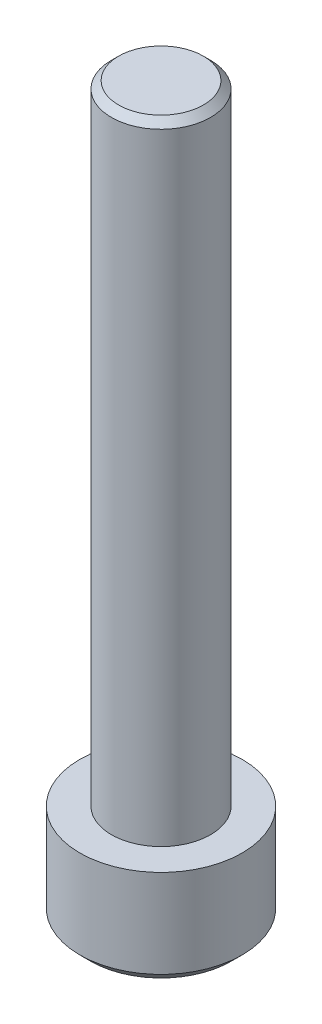
ISO-10303-21;
HEADER;
FILE_DESCRIPTION(('STEP AP214'),'2;1');
FILE_NAME('part.step','',(''),(''),'','','');
FILE_SCHEMA(('AUTOMOTIVE_DESIGN { 1 0 10303 214 1 1 1 1 }'));
ENDSEC;
DATA;
#1=APPLICATION_CONTEXT('core data for automotive mechanical design processes');
#2=APPLICATION_PROTOCOL_DEFINITION('international standard','automotive_design',2000,#1);
#3=PRODUCT_CONTEXT('',#1,'mechanical');
#4=PRODUCT('Part','Part','',(#3));
#5=PRODUCT_RELATED_PRODUCT_CATEGORY('part','',(#4));
#6=PRODUCT_DEFINITION_FORMATION('','',#4);
#7=PRODUCT_DEFINITION_CONTEXT('part definition',#1,'design');
#8=PRODUCT_DEFINITION('design','',#6,#7);
#9=PRODUCT_DEFINITION_SHAPE('','',#8);
#10=(LENGTH_UNIT() NAMED_UNIT(*) SI_UNIT(.MILLI.,.METRE.));
#11=(NAMED_UNIT(*) PLANE_ANGLE_UNIT() SI_UNIT($,.RADIAN.));
#12=(NAMED_UNIT(*) SI_UNIT($,.STERADIAN.) SOLID_ANGLE_UNIT());
#13=UNCERTAINTY_MEASURE_WITH_UNIT(LENGTH_MEASURE(1.E-05),#10,'distance_accuracy_value','');
#14=(GEOMETRIC_REPRESENTATION_CONTEXT(3) GLOBAL_UNCERTAINTY_ASSIGNED_CONTEXT((#13)) GLOBAL_UNIT_ASSIGNED_CONTEXT((#10,
#11,#12)) REPRESENTATION_CONTEXT('',''));
#15=CARTESIAN_POINT('',(0.,0.,0.));
#16=DIRECTION('',(0.,0.,1.));
#17=DIRECTION('',(1.,0.,0.));
#18=AXIS2_PLACEMENT_3D('',#15,#16,#17);
#19=CARTESIAN_POINT('',(-1.60395121659243,-0.2032,0.));
#20=DIRECTION('',(-0.866025403784439,0.,-0.5));
#21=DIRECTION('',(-0.5,0.,0.866025403784439));
#22=AXIS2_PLACEMENT_3D('',#19,#20,#21);
#23=PLANE('',#22);
#24=DIRECTION('',(0.,1.,0.));
#25=VECTOR('',#24,1.);
#26=CARTESIAN_POINT('',(-0.801975608296215,-0.2032,-1.3890625));
#27=LINE('',#26,#25);
#28=CARTESIAN_POINT('',(-0.801975608296215,-3.5052,-1.3890625));
#29=VERTEX_POINT('',#28);
#30=CARTESIAN_POINT('',(-0.801975608296215,-0.2032,-1.3890625));
#31=VERTEX_POINT('',#30);
#32=EDGE_CURVE('E83',#29,#31,#27,.T.);
#33=ORIENTED_EDGE('',*,*,#32,.T.);
#34=DIRECTION('',(-0.5,0.,0.866025403784439));
#35=VECTOR('',#34,1.);
#36=CARTESIAN_POINT('',(-1.60395121659243,-0.2032,0.));
#37=LINE('',#36,#35);
#38=CARTESIAN_POINT('',(-1.60395121659243,-0.2032,0.));
#39=VERTEX_POINT('',#38);
#40=EDGE_CURVE('E72',#39,#31,#37,.F.);
#41=ORIENTED_EDGE('',*,*,#40,.F.);
#42=DIRECTION('',(0.,1.,0.));
#43=VECTOR('',#42,1.);
#44=CARTESIAN_POINT('',(-1.60395121659243,-0.2032,0.));
#45=LINE('',#44,#43);
#46=CARTESIAN_POINT('',(-1.60395121659243,-3.5052,0.));
#47=VERTEX_POINT('',#46);
#48=EDGE_CURVE('E91',#39,#47,#45,.F.);
#49=ORIENTED_EDGE('',*,*,#48,.T.);
#50=DIRECTION('',(-0.5,0.,0.866025403784439));
#51=VECTOR('',#50,1.);
#52=CARTESIAN_POINT('',(-1.60395121659243,-3.5052,0.));
#53=LINE('',#52,#51);
#54=EDGE_CURVE('E67',#29,#47,#53,.T.);
#55=ORIENTED_EDGE('',*,*,#54,.F.);
#56=EDGE_LOOP('',(#33,#41,#49,#55));
#57=FACE_BOUND('',#56,.T.);
#58=ADVANCED_FACE('F17',(#57),#23,.F.);
#59=CARTESIAN_POINT('',(-0.801975608296215,-0.2032,-1.3890625));
#60=DIRECTION('',(0.,0.,-1.));
#61=DIRECTION('',(-1.,0.,0.));
#62=AXIS2_PLACEMENT_3D('',#59,#60,#61);
#63=PLANE('',#62);
#64=DIRECTION('',(0.,1.,0.));
#65=VECTOR('',#64,1.);
#66=CARTESIAN_POINT('',(0.801975608296215,-0.2032,-1.3890625));
#67=LINE('',#66,#65);
#68=CARTESIAN_POINT('',(0.801975608296215,-3.5052,-1.3890625));
#69=VERTEX_POINT('',#68);
#70=CARTESIAN_POINT('',(0.801975608296215,-0.2032,-1.3890625));
#71=VERTEX_POINT('',#70);
#72=EDGE_CURVE('E87',#69,#71,#67,.T.);
#73=ORIENTED_EDGE('',*,*,#72,.T.);
#74=DIRECTION('',(-1.,0.,0.));
#75=VECTOR('',#74,1.);
#76=CARTESIAN_POINT('',(-0.801975608296215,-0.2032,-1.3890625));
#77=LINE('',#76,#75);
#78=EDGE_CURVE('E76',#31,#71,#77,.F.);
#79=ORIENTED_EDGE('',*,*,#78,.F.);
#80=ORIENTED_EDGE('',*,*,#32,.F.);
#81=DIRECTION('',(-1.,0.,0.));
#82=VECTOR('',#81,1.);
#83=CARTESIAN_POINT('',(-0.801975608296215,-3.5052,-1.3890625));
#84=LINE('',#83,#82);
#85=EDGE_CURVE('E89',#69,#29,#84,.T.);
#86=ORIENTED_EDGE('',*,*,#85,.F.);
#87=EDGE_LOOP('',(#73,#79,#80,#86));
#88=FACE_BOUND('',#87,.T.);
#89=ADVANCED_FACE('F86',(#88),#63,.F.);
#90=CARTESIAN_POINT('',(-0.801975608296216,-0.2032,1.3890625));
#91=DIRECTION('',(-0.866025403784439,0.,0.5));
#92=DIRECTION('',(0.5,0.,0.866025403784439));
#93=AXIS2_PLACEMENT_3D('',#90,#91,#92);
#94=PLANE('',#93);
#95=ORIENTED_EDGE('',*,*,#48,.F.);
#96=DIRECTION('',(-0.5,0.,-0.866025403784439));
#97=VECTOR('',#96,1.);
#98=CARTESIAN_POINT('',(-0.801975608296216,-0.2032,1.3890625));
#99=LINE('',#98,#97);
#100=CARTESIAN_POINT('',(-0.801975608296216,-0.2032,1.3890625));
#101=VERTEX_POINT('',#100);
#102=EDGE_CURVE('E79',#101,#39,#99,.T.);
#103=ORIENTED_EDGE('',*,*,#102,.F.);
#104=DIRECTION('',(0.,1.,0.));
#105=VECTOR('',#104,1.);
#106=CARTESIAN_POINT('',(-0.801975608296216,-0.2032,1.3890625));
#107=LINE('',#106,#105);
#108=CARTESIAN_POINT('',(-0.801975608296216,-3.5052,1.3890625));
#109=VERTEX_POINT('',#108);
#110=EDGE_CURVE('E122',#101,#109,#107,.F.);
#111=ORIENTED_EDGE('',*,*,#110,.T.);
#112=DIRECTION('',(0.5,0.,0.866025403784439));
#113=VECTOR('',#112,1.);
#114=CARTESIAN_POINT('',(-0.801975608296216,-3.5052,1.3890625));
#115=LINE('',#114,#113);
#116=EDGE_CURVE('E132',#47,#109,#115,.T.);
#117=ORIENTED_EDGE('',*,*,#116,.F.);
#118=EDGE_LOOP('',(#95,#103,#111,#117));
#119=FACE_BOUND('',#118,.T.);
#120=ADVANCED_FACE('F135',(#119),#94,.F.);
#121=CARTESIAN_POINT('',(0.801975608296215,-0.2032,-1.3890625));
#122=DIRECTION('',(0.866025403784439,0.,-0.5));
#123=DIRECTION('',(-0.5,0.,-0.866025403784439));
#124=AXIS2_PLACEMENT_3D('',#121,#122,#123);
#125=PLANE('',#124);
#126=DIRECTION('',(0.,1.,0.));
#127=VECTOR('',#126,1.);
#128=CARTESIAN_POINT('',(1.60395121659243,-0.2032,0.));
#129=LINE('',#128,#127);
#130=CARTESIAN_POINT('',(1.60395121659243,-3.5052,0.));
#131=VERTEX_POINT('',#130);
#132=CARTESIAN_POINT('',(1.60395121659243,-0.2032,0.));
#133=VERTEX_POINT('',#132);
#134=EDGE_CURVE('E118',#131,#133,#129,.T.);
#135=ORIENTED_EDGE('',*,*,#134,.T.);
#136=DIRECTION('',(0.5,0.,0.866025403784439));
#137=VECTOR('',#136,1.);
#138=CARTESIAN_POINT('',(0.801975608296215,-0.2032,-1.3890625));
#139=LINE('',#138,#137);
#140=EDGE_CURVE('E128',#71,#133,#139,.T.);
#141=ORIENTED_EDGE('',*,*,#140,.F.);
#142=ORIENTED_EDGE('',*,*,#72,.F.);
#143=DIRECTION('',(-0.5,0.,-0.866025403784439));
#144=VECTOR('',#143,1.);
#145=CARTESIAN_POINT('',(0.801975608296215,-3.5052,-1.3890625));
#146=LINE('',#145,#144);
#147=EDGE_CURVE('E35',#131,#69,#146,.T.);
#148=ORIENTED_EDGE('',*,*,#147,.F.);
#149=EDGE_LOOP('',(#135,#141,#142,#148));
#150=FACE_BOUND('',#149,.T.);
#151=ADVANCED_FACE('F142',(#150),#125,.F.);
#152=CARTESIAN_POINT('',(1.60395121659243,-0.2032,0.));
#153=DIRECTION('',(0.,-1.,0.));
#154=DIRECTION('',(0.,0.,-1.));
#155=AXIS2_PLACEMENT_3D('',#152,#153,#154);
#156=PLANE('',#155);
#157=ORIENTED_EDGE('',*,*,#40,.T.);
#158=ORIENTED_EDGE('',*,*,#78,.T.);
#159=ORIENTED_EDGE('',*,*,#140,.T.);
#160=DIRECTION('',(0.5,0.,-0.866025403784439));
#161=VECTOR('',#160,1.);
#162=CARTESIAN_POINT('',(1.60395121659243,-0.2032,0.));
#163=LINE('',#162,#161);
#164=CARTESIAN_POINT('',(0.801975608296215,-0.2032,1.3890625));
#165=VERTEX_POINT('',#164);
#166=EDGE_CURVE('E116',#133,#165,#163,.F.);
#167=ORIENTED_EDGE('',*,*,#166,.T.);
#168=DIRECTION('',(1.,0.,0.));
#169=VECTOR('',#168,1.);
#170=CARTESIAN_POINT('',(0.801975608296215,-0.2032,1.3890625));
#171=LINE('',#170,#169);
#172=EDGE_CURVE('E125',#165,#101,#171,.F.);
#173=ORIENTED_EDGE('',*,*,#172,.T.);
#174=ORIENTED_EDGE('',*,*,#102,.T.);
#175=EDGE_LOOP('',(#157,#158,#159,#167,#173,#174));
#176=FACE_BOUND('',#175,.T.);
#177=ADVANCED_FACE('F73',(#176),#156,.T.);
#178=CARTESIAN_POINT('',(0.801975608296215,-0.2032,1.3890625));
#179=DIRECTION('',(0.,0.,1.));
#180=DIRECTION('',(1.,0.,0.));
#181=AXIS2_PLACEMENT_3D('',#178,#179,#180);
#182=PLANE('',#181);
#183=ORIENTED_EDGE('',*,*,#110,.F.);
#184=ORIENTED_EDGE('',*,*,#172,.F.);
#185=DIRECTION('',(0.,1.,0.));
#186=VECTOR('',#185,1.);
#187=CARTESIAN_POINT('',(0.801975608296214,-0.2032,1.3890625));
#188=LINE('',#187,#186);
#189=CARTESIAN_POINT('',(0.801975608296215,-3.5052,1.3890625));
#190=VERTEX_POINT('',#189);
#191=EDGE_CURVE('E113',#165,#190,#188,.F.);
#192=ORIENTED_EDGE('',*,*,#191,.T.);
#193=DIRECTION('',(1.,0.,0.));
#194=VECTOR('',#193,1.);
#195=CARTESIAN_POINT('',(0.801975608296215,-3.5052,1.3890625));
#196=LINE('',#195,#194);
#197=EDGE_CURVE('E120',#109,#190,#196,.T.);
#198=ORIENTED_EDGE('',*,*,#197,.F.);
#199=EDGE_LOOP('',(#183,#184,#192,#198));
#200=FACE_BOUND('',#199,.T.);
#201=ADVANCED_FACE('F149',(#200),#182,.F.);
#202=CARTESIAN_POINT('',(1.60395121659243,-0.2032,0.));
#203=DIRECTION('',(0.866025403784439,0.,0.5));
#204=DIRECTION('',(0.5,0.,-0.866025403784439));
#205=AXIS2_PLACEMENT_3D('',#202,#203,#204);
#206=PLANE('',#205);
#207=ORIENTED_EDGE('',*,*,#191,.F.);
#208=ORIENTED_EDGE('',*,*,#166,.F.);
#209=ORIENTED_EDGE('',*,*,#134,.F.);
#210=DIRECTION('',(-0.5,0.,0.866025403784438));
#211=VECTOR('',#210,1.);
#212=CARTESIAN_POINT('',(1.60395121659243,-3.5052,0.));
#213=LINE('',#212,#211);
#214=EDGE_CURVE('E108',#131,#190,#213,.T.);
#215=ORIENTED_EDGE('',*,*,#214,.T.);
#216=EDGE_LOOP('',(#207,#208,#209,#215));
#217=FACE_BOUND('',#216,.T.);
#218=ADVANCED_FACE('F147',(#217),#206,.F.);
#219=CARTESIAN_POINT('',(0.,-3.5052,0.));
#220=DIRECTION('',(0.,1.,0.));
#221=DIRECTION('',(0.,0.,1.));
#222=AXIS2_PLACEMENT_3D('',#219,#220,#221);
#223=PLANE('',#222);
#224=ORIENTED_EDGE('',*,*,#147,.T.);
#225=ORIENTED_EDGE('',*,*,#85,.T.);
#226=ORIENTED_EDGE('',*,*,#54,.T.);
#227=ORIENTED_EDGE('',*,*,#116,.T.);
#228=ORIENTED_EDGE('',*,*,#197,.T.);
#229=ORIENTED_EDGE('',*,*,#214,.F.);
#230=EDGE_LOOP('',(#224,#225,#226,#227,#228,#229));
#231=FACE_BOUND('',#230,.T.);
#232=CARTESIAN_POINT('',(0.,-3.50520000006327,0.));
#233=DIRECTION('',(0.,1.,0.));
#234=DIRECTION('',(0.,0.,1.));
#235=AXIS2_PLACEMENT_3D('',#232,#233,#234);
#236=CIRCLE('',#235,2.48919999995678);
#237=CARTESIAN_POINT('',(0.,-3.50520000006327,2.48919999995678));
#238=VERTEX_POINT('',#237);
#239=EDGE_CURVE('E20',#238,#238,#236,.T.);
#240=ORIENTED_EDGE('',*,*,#239,.F.);
#241=EDGE_LOOP('',(#240));
#242=FACE_BOUND('',#241,.T.);
#243=ADVANCED_FACE('F139',(#231,#242),#223,.F.);
#244=CARTESIAN_POINT('',(0.,-3.12420000005886,0.));
#245=DIRECTION('',(0.,1.,0.));
#246=DIRECTION('',(0.,0.,1.));
#247=AXIS2_PLACEMENT_3D('',#244,#245,#246);
#248=CONICAL_SURFACE('',#247,2.87019999996119,0.785398163397448);
#249=ORIENTED_EDGE('',*,*,#239,.T.);
#250=EDGE_LOOP('',(#249));
#251=FACE_BOUND('',#250,.T.);
#252=CARTESIAN_POINT('',(0.,-3.1242,0.));
#253=DIRECTION('',(0.,1.,0.));
#254=DIRECTION('',(0.,0.,1.));
#255=AXIS2_PLACEMENT_3D('',#252,#253,#254);
#256=CIRCLE('',#255,2.8702);
#257=CARTESIAN_POINT('',(0.,-3.1242,2.8702));
#258=VERTEX_POINT('',#257);
#259=EDGE_CURVE('E100',#258,#258,#256,.T.);
#260=ORIENTED_EDGE('',*,*,#259,.F.);
#261=EDGE_LOOP('',(#260));
#262=FACE_BOUND('',#261,.T.);
#263=ADVANCED_FACE('F181',(#251,#262),#248,.T.);
#264=CARTESIAN_POINT('',(0.,22.225,0.));
#265=DIRECTION('',(0.,1.,0.));
#266=DIRECTION('',(0.,0.,1.));
#267=AXIS2_PLACEMENT_3D('',#264,#265,#266);
#268=PLANE('',#267);
#269=CARTESIAN_POINT('',(0.,22.2250000000486,0.));
#270=DIRECTION('',(0.,-1.,0.));
#271=DIRECTION('',(0.,0.,-1.));
#272=AXIS2_PLACEMENT_3D('',#269,#270,#271);
#273=CIRCLE('',#272,1.4985999999908);
#274=CARTESIAN_POINT('',(0.,22.2250000000486,-1.4985999999908));
#275=VERTEX_POINT('',#274);
#276=EDGE_CURVE('E98',#275,#275,#273,.T.);
#277=ORIENTED_EDGE('',*,*,#276,.F.);
#278=EDGE_LOOP('',(#277));
#279=FACE_BOUND('',#278,.T.);
#280=ADVANCED_FACE('F178',(#279),#268,.T.);
#281=CARTESIAN_POINT('',(0.,-3.5052,0.));
#282=DIRECTION('',(0.,1.,0.));
#283=DIRECTION('',(0.,0.,1.));
#284=AXIS2_PLACEMENT_3D('',#281,#282,#283);
#285=CYLINDRICAL_SURFACE('',#284,2.8702);
#286=ORIENTED_EDGE('',*,*,#259,.T.);
#287=EDGE_LOOP('',(#286));
#288=FACE_BOUND('',#287,.T.);
#289=CARTESIAN_POINT('',(0.,0.,0.));
#290=DIRECTION('',(0.,1.,0.));
#291=DIRECTION('',(0.,0.,1.));
#292=AXIS2_PLACEMENT_3D('',#289,#290,#291);
#293=CIRCLE('',#292,2.8702);
#294=CARTESIAN_POINT('',(0.,0.,2.8702));
#295=VERTEX_POINT('',#294);
#296=EDGE_CURVE('E96',#295,#295,#293,.T.);
#297=ORIENTED_EDGE('',*,*,#296,.F.);
#298=EDGE_LOOP('',(#297));
#299=FACE_BOUND('',#298,.T.);
#300=ADVANCED_FACE('F174',(#288,#299),#285,.T.);
#301=CARTESIAN_POINT('',(0.,21.9710000002351,0.));
#302=DIRECTION('',(0.,-1.,0.));
#303=DIRECTION('',(0.,0.,-1.));
#304=AXIS2_PLACEMENT_3D('',#301,#302,#303);
#305=CONICAL_SURFACE('',#304,1.75259999980426,0.785398163397448);
#306=CARTESIAN_POINT('',(0.,21.971,0.));
#307=DIRECTION('',(0.,-1.,0.));
#308=DIRECTION('',(0.,0.,-1.));
#309=AXIS2_PLACEMENT_3D('',#306,#307,#308);
#310=CIRCLE('',#309,1.7526);
#311=CARTESIAN_POINT('',(0.,21.971,-1.7526));
#312=VERTEX_POINT('',#311);
#313=EDGE_CURVE('E26',#312,#312,#310,.T.);
#314=ORIENTED_EDGE('',*,*,#313,.F.);
#315=EDGE_LOOP('',(#314));
#316=FACE_BOUND('',#315,.T.);
#317=ORIENTED_EDGE('',*,*,#276,.T.);
#318=EDGE_LOOP('',(#317));
#319=FACE_BOUND('',#318,.T.);
#320=ADVANCED_FACE('F167',(#316,#319),#305,.T.);
#321=CARTESIAN_POINT('',(0.,0.,0.));
#322=DIRECTION('',(0.,1.,0.));
#323=DIRECTION('',(0.,0.,1.));
#324=AXIS2_PLACEMENT_3D('',#321,#322,#323);
#325=PLANE('',#324);
#326=CARTESIAN_POINT('',(0.,0.,0.));
#327=DIRECTION('',(0.,-1.,0.));
#328=DIRECTION('',(0.,0.,-1.));
#329=AXIS2_PLACEMENT_3D('',#326,#327,#328);
#330=CIRCLE('',#329,1.7526);
#331=CARTESIAN_POINT('',(0.,0.,-1.7526));
#332=VERTEX_POINT('',#331);
#333=EDGE_CURVE('E11',#332,#332,#330,.F.);
#334=ORIENTED_EDGE('',*,*,#333,.F.);
#335=EDGE_LOOP('',(#334));
#336=FACE_BOUND('',#335,.T.);
#337=ORIENTED_EDGE('',*,*,#296,.T.);
#338=EDGE_LOOP('',(#337));
#339=FACE_BOUND('',#338,.T.);
#340=ADVANCED_FACE('F161',(#336,#339),#325,.T.);
#341=CARTESIAN_POINT('',(0.,22.225,0.));
#342=DIRECTION('',(0.,-1.,0.));
#343=DIRECTION('',(0.,0.,-1.));
#344=AXIS2_PLACEMENT_3D('',#341,#342,#343);
#345=CYLINDRICAL_SURFACE('',#344,1.7526);
#346=ORIENTED_EDGE('',*,*,#333,.T.);
#347=EDGE_LOOP('',(#346));
#348=FACE_BOUND('',#347,.T.);
#349=ORIENTED_EDGE('',*,*,#313,.T.);
#350=EDGE_LOOP('',(#349));
#351=FACE_BOUND('',#350,.T.);
#352=ADVANCED_FACE('F159',(#348,#351),#345,.T.);
#353=CLOSED_SHELL('',(#58,#89,#120,#151,#177,#201,#218,#243,#263,#280,#300,#320,#340,#352));
#354=MANIFOLD_SOLID_BREP('B1',#353);
#355=ADVANCED_BREP_SHAPE_REPRESENTATION('',(#18,#354),#14);
#356=SHAPE_DEFINITION_REPRESENTATION(#9,#355);
ENDSEC;
END-ISO-10303-21;
